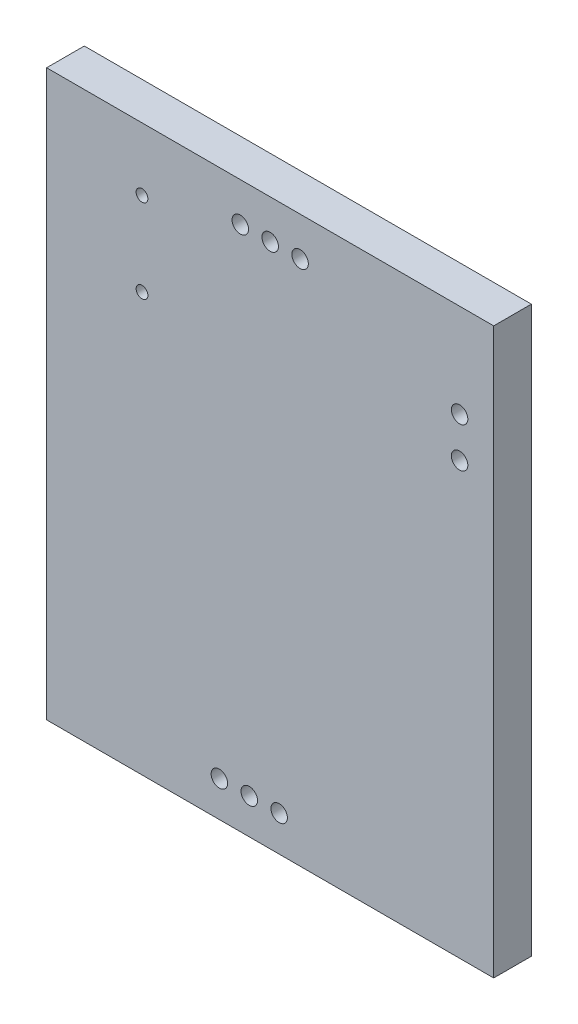
ISO-10303-21;
HEADER;
FILE_DESCRIPTION(('STEP AP214'),'2;1');
FILE_NAME('part.step','',(''),(''),'','','');
FILE_SCHEMA(('AUTOMOTIVE_DESIGN { 1 0 10303 214 1 1 1 1 }'));
ENDSEC;
DATA;
#1=APPLICATION_CONTEXT('core data for automotive mechanical design processes');
#2=APPLICATION_PROTOCOL_DEFINITION('international standard','automotive_design',2000,#1);
#3=PRODUCT_CONTEXT('',#1,'mechanical');
#4=PRODUCT('Part','Part','',(#3));
#5=PRODUCT_RELATED_PRODUCT_CATEGORY('part','',(#4));
#6=PRODUCT_DEFINITION_FORMATION('','',#4);
#7=PRODUCT_DEFINITION_CONTEXT('part definition',#1,'design');
#8=PRODUCT_DEFINITION('design','',#6,#7);
#9=PRODUCT_DEFINITION_SHAPE('','',#8);
#10=(LENGTH_UNIT() NAMED_UNIT(*) SI_UNIT(.MILLI.,.METRE.));
#11=(NAMED_UNIT(*) PLANE_ANGLE_UNIT() SI_UNIT($,.RADIAN.));
#12=(NAMED_UNIT(*) SI_UNIT($,.STERADIAN.) SOLID_ANGLE_UNIT());
#13=UNCERTAINTY_MEASURE_WITH_UNIT(LENGTH_MEASURE(1.E-05),#10,'distance_accuracy_value','');
#14=(GEOMETRIC_REPRESENTATION_CONTEXT(3) GLOBAL_UNCERTAINTY_ASSIGNED_CONTEXT((#13)) GLOBAL_UNIT_ASSIGNED_CONTEXT((#10,
#11,#12)) REPRESENTATION_CONTEXT('',''));
#15=CARTESIAN_POINT('',(0.,0.,0.));
#16=DIRECTION('',(0.,0.,1.));
#17=DIRECTION('',(1.,0.,0.));
#18=AXIS2_PLACEMENT_3D('',#15,#16,#17);
#19=CARTESIAN_POINT('',(19.668039116078,-21.26320315023,1.600028244856));
#20=DIRECTION('',(0.,0.,-1.));
#21=DIRECTION('',(-1.,0.,0.));
#22=AXIS2_PLACEMENT_3D('',#19,#20,#21);
#23=PLANE('',#22);
#24=CARTESIAN_POINT('',(27.714503429007,-14.94716789433,1.600028244856));
#25=DIRECTION('',(0.,0.,-1.));
#26=DIRECTION('',(-1.,0.,0.));
#27=AXIS2_PLACEMENT_3D('',#24,#25,#26);
#28=CIRCLE('',#27,0.350012700025);
#29=CARTESIAN_POINT('',(27.364490728982,-14.94716789433,1.600028244856));
#30=VERTEX_POINT('',#29);
#31=EDGE_CURVE('E108',#30,#30,#28,.T.);
#32=ORIENTED_EDGE('',*,*,#31,.T.);
#33=EDGE_LOOP('',(#32));
#34=FACE_BOUND('',#33,.T.);
#35=CARTESIAN_POINT('',(27.714503429007,-13.24714249428,1.600028244856));
#36=DIRECTION('',(0.,0.,-1.));
#37=DIRECTION('',(-1.,0.,0.));
#38=AXIS2_PLACEMENT_3D('',#35,#36,#37);
#39=CIRCLE('',#38,0.350012700025);
#40=CARTESIAN_POINT('',(27.364490728982,-13.24714249428,1.600028244856));
#41=VERTEX_POINT('',#40);
#42=EDGE_CURVE('E112',#41,#41,#39,.T.);
#43=ORIENTED_EDGE('',*,*,#42,.T.);
#44=EDGE_LOOP('',(#43));
#45=FACE_BOUND('',#44,.T.);
#46=CARTESIAN_POINT('',(20.939057658115,-10.92202184404,1.600028244856));
#47=DIRECTION('',(0.,0.,-1.));
#48=DIRECTION('',(-1.,0.,0.));
#49=AXIS2_PLACEMENT_3D('',#46,#47,#48);
#50=CIRCLE('',#49,0.350012700025);
#51=CARTESIAN_POINT('',(20.58904495809,-10.92202184404,1.600028244856));
#52=VERTEX_POINT('',#51);
#53=EDGE_CURVE('E115',#52,#52,#50,.T.);
#54=ORIENTED_EDGE('',*,*,#53,.T.);
#55=EDGE_LOOP('',(#54));
#56=FACE_BOUND('',#55,.T.);
#57=CARTESIAN_POINT('',(20.0508001016,-31.75006350012,1.600028244856));
#58=DIRECTION('',(0.,0.,-1.));
#59=DIRECTION('',(-1.,0.,0.));
#60=AXIS2_PLACEMENT_3D('',#57,#58,#59);
#61=CIRCLE('',#60,0.350012700025);
#62=CARTESIAN_POINT('',(19.700787401575,-31.75006350012,1.600028244856));
#63=VERTEX_POINT('',#62);
#64=EDGE_CURVE('E118',#63,#63,#61,.T.);
#65=ORIENTED_EDGE('',*,*,#64,.T.);
#66=EDGE_LOOP('',(#65));
#67=FACE_BOUND('',#66,.T.);
#68=CARTESIAN_POINT('',(19.66905511811,-10.92202184404,1.600028244856));
#69=DIRECTION('',(0.,0.,-1.));
#70=DIRECTION('',(-1.,0.,0.));
#71=AXIS2_PLACEMENT_3D('',#68,#69,#70);
#72=CIRCLE('',#71,0.350012700025);
#73=CARTESIAN_POINT('',(19.319042418085,-10.92202184404,1.600028244856));
#74=VERTEX_POINT('',#73);
#75=EDGE_CURVE('E121',#74,#74,#72,.T.);
#76=ORIENTED_EDGE('',*,*,#75,.T.);
#77=EDGE_LOOP('',(#76));
#78=FACE_BOUND('',#77,.T.);
#79=CARTESIAN_POINT('',(18.780797561595,-31.75006350012,1.600028244856));
#80=DIRECTION('',(0.,0.,-1.));
#81=DIRECTION('',(-1.,0.,0.));
#82=AXIS2_PLACEMENT_3D('',#79,#80,#81);
#83=CIRCLE('',#82,0.350012700025);
#84=CARTESIAN_POINT('',(18.43078486157,-31.75006350012,1.600028244856));
#85=VERTEX_POINT('',#84);
#86=EDGE_CURVE('E124',#85,#85,#83,.T.);
#87=ORIENTED_EDGE('',*,*,#86,.T.);
#88=EDGE_LOOP('',(#87));
#89=FACE_BOUND('',#88,.T.);
#90=CARTESIAN_POINT('',(18.399052578105,-10.92202184404,1.600028244856));
#91=DIRECTION('',(0.,0.,-1.));
#92=DIRECTION('',(-1.,0.,0.));
#93=AXIS2_PLACEMENT_3D('',#90,#91,#92);
#94=CIRCLE('',#93,0.350012700025);
#95=CARTESIAN_POINT('',(18.04903987808,-10.92202184404,1.600028244856));
#96=VERTEX_POINT('',#95);
#97=EDGE_CURVE('E127',#96,#96,#94,.T.);
#98=ORIENTED_EDGE('',*,*,#97,.T.);
#99=EDGE_LOOP('',(#98));
#100=FACE_BOUND('',#99,.T.);
#101=CARTESIAN_POINT('',(17.51079502159,-31.75006350012,1.600028244856));
#102=DIRECTION('',(0.,0.,-1.));
#103=DIRECTION('',(-1.,0.,0.));
#104=AXIS2_PLACEMENT_3D('',#101,#102,#103);
#105=CIRCLE('',#104,0.350012700025);
#106=CARTESIAN_POINT('',(17.160782321565,-31.75006350012,1.600028244856));
#107=VERTEX_POINT('',#106);
#108=EDGE_CURVE('E130',#107,#107,#105,.T.);
#109=ORIENTED_EDGE('',*,*,#108,.T.);
#110=EDGE_LOOP('',(#109));
#111=FACE_BOUND('',#110,.T.);
#112=CARTESIAN_POINT('',(14.224028448057,-15.49403098806,1.600028244856));
#113=DIRECTION('',(0.,0.,-1.));
#114=DIRECTION('',(-1.,0.,0.));
#115=AXIS2_PLACEMENT_3D('',#112,#113,#114);
#116=CIRCLE('',#115,0.25);
#117=CARTESIAN_POINT('',(13.974028448057,-15.49403098806,1.600028244856));
#118=VERTEX_POINT('',#117);
#119=EDGE_CURVE('E132',#118,#118,#116,.T.);
#120=ORIENTED_EDGE('',*,*,#119,.T.);
#121=EDGE_LOOP('',(#120));
#122=FACE_BOUND('',#121,.T.);
#123=CARTESIAN_POINT('',(14.224028448057,-11.93802387604,1.600028244856));
#124=DIRECTION('',(0.,0.,-1.));
#125=DIRECTION('',(-1.,0.,0.));
#126=AXIS2_PLACEMENT_3D('',#123,#124,#125);
#127=CIRCLE('',#126,0.25);
#128=CARTESIAN_POINT('',(13.974028448057,-11.93802387604,1.600028244856));
#129=VERTEX_POINT('',#128);
#130=EDGE_CURVE('E20',#129,#129,#127,.T.);
#131=ORIENTED_EDGE('',*,*,#130,.T.);
#132=EDGE_LOOP('',(#131));
#133=FACE_BOUND('',#132,.T.);
#134=DIRECTION('',(0.,-1.,0.));
#135=VECTOR('',#134,1.);
#136=CARTESIAN_POINT('',(10.172720345441,-33.25836677673,1.600028244856));
#137=LINE('',#136,#135);
#138=CARTESIAN_POINT('',(10.172720345441,-33.25836677673,1.600028244856));
#139=VERTEX_POINT('',#138);
#140=CARTESIAN_POINT('',(10.172720345441,-9.268039523733,1.600028244856));
#141=VERTEX_POINT('',#140);
#142=EDGE_CURVE('E70',#139,#141,#137,.F.);
#143=ORIENTED_EDGE('',*,*,#142,.F.);
#144=DIRECTION('',(1.,0.,0.));
#145=VECTOR('',#144,1.);
#146=CARTESIAN_POINT('',(29.163357886716,-33.25836677673,1.600028244856));
#147=LINE('',#146,#145);
#148=CARTESIAN_POINT('',(29.163357886716,-33.25836677673,1.600028244856));
#149=VERTEX_POINT('',#148);
#150=EDGE_CURVE('E55',#149,#139,#147,.F.);
#151=ORIENTED_EDGE('',*,*,#150,.F.);
#152=DIRECTION('',(0.,1.,0.));
#153=VECTOR('',#152,1.);
#154=CARTESIAN_POINT('',(29.163357886716,-9.268039523733,1.600028244856));
#155=LINE('',#154,#153);
#156=CARTESIAN_POINT('',(29.163357886716,-9.268039523733,1.600028244856));
#157=VERTEX_POINT('',#156);
#158=EDGE_CURVE('E60',#157,#149,#155,.F.);
#159=ORIENTED_EDGE('',*,*,#158,.F.);
#160=DIRECTION('',(1.,0.,0.));
#161=VECTOR('',#160,1.);
#162=CARTESIAN_POINT('',(10.172720345441,-9.268039523733,1.600028244856));
#163=LINE('',#162,#161);
#164=EDGE_CURVE('E139',#141,#157,#163,.T.);
#165=ORIENTED_EDGE('',*,*,#164,.F.);
#166=EDGE_LOOP('',(#143,#151,#159,#165));
#167=FACE_BOUND('',#166,.T.);
#168=ADVANCED_FACE('F17',(#34,#45,#56,#67,#78,#89,#100,#111,#122,#133,#167),#23,.F.);
#169=CARTESIAN_POINT('',(29.163357886716,-9.268039523733,0.));
#170=DIRECTION('',(1.,0.,0.));
#171=DIRECTION('',(0.,0.,-1.));
#172=AXIS2_PLACEMENT_3D('',#169,#170,#171);
#173=PLANE('',#172);
#174=DIRECTION('',(0.,0.,-1.));
#175=VECTOR('',#174,1.);
#176=CARTESIAN_POINT('',(29.163357886716,-33.25836677673,0.));
#177=LINE('',#176,#175);
#178=CARTESIAN_POINT('',(29.163357886716,-33.25836677673,0.));
#179=VERTEX_POINT('',#178);
#180=EDGE_CURVE('E62',#179,#149,#177,.F.);
#181=ORIENTED_EDGE('',*,*,#180,.F.);
#182=DIRECTION('',(0.,1.,0.));
#183=VECTOR('',#182,1.);
#184=CARTESIAN_POINT('',(29.163357886716,-21.26320315023,0.));
#185=LINE('',#184,#183);
#186=CARTESIAN_POINT('',(29.163357886716,-9.268039523733,0.));
#187=VERTEX_POINT('',#186);
#188=EDGE_CURVE('E111',#187,#179,#185,.F.);
#189=ORIENTED_EDGE('',*,*,#188,.F.);
#190=DIRECTION('',(0.,0.,1.));
#191=VECTOR('',#190,1.);
#192=CARTESIAN_POINT('',(29.163357886716,-9.268039523733,0.));
#193=LINE('',#192,#191);
#194=EDGE_CURVE('E65',#157,#187,#193,.F.);
#195=ORIENTED_EDGE('',*,*,#194,.F.);
#196=ORIENTED_EDGE('',*,*,#158,.T.);
#197=EDGE_LOOP('',(#181,#189,#195,#196));
#198=FACE_BOUND('',#197,.T.);
#199=ADVANCED_FACE('F61',(#198),#173,.T.);
#200=CARTESIAN_POINT('',(29.163357886716,-33.25836677673,0.));
#201=DIRECTION('',(0.,-1.,0.));
#202=DIRECTION('',(0.,0.,-1.));
#203=AXIS2_PLACEMENT_3D('',#200,#201,#202);
#204=PLANE('',#203);
#205=DIRECTION('',(0.,0.,1.));
#206=VECTOR('',#205,1.);
#207=CARTESIAN_POINT('',(10.172720345441,-33.25836677673,0.));
#208=LINE('',#207,#206);
#209=CARTESIAN_POINT('',(10.172720345441,-33.25836677673,0.));
#210=VERTEX_POINT('',#209);
#211=EDGE_CURVE('E72',#210,#139,#208,.T.);
#212=ORIENTED_EDGE('',*,*,#211,.F.);
#213=DIRECTION('',(-1.,0.,0.));
#214=VECTOR('',#213,1.);
#215=CARTESIAN_POINT('',(19.668039116078,-33.25836677673,0.));
#216=LINE('',#215,#214);
#217=EDGE_CURVE('E76',#179,#210,#216,.T.);
#218=ORIENTED_EDGE('',*,*,#217,.F.);
#219=ORIENTED_EDGE('',*,*,#180,.T.);
#220=ORIENTED_EDGE('',*,*,#150,.T.);
#221=EDGE_LOOP('',(#212,#218,#219,#220));
#222=FACE_BOUND('',#221,.T.);
#223=ADVANCED_FACE('F74',(#222),#204,.T.);
#224=CARTESIAN_POINT('',(10.172720345441,-33.25836677673,0.));
#225=DIRECTION('',(-1.,0.,0.));
#226=DIRECTION('',(0.,-1.,0.));
#227=AXIS2_PLACEMENT_3D('',#224,#225,#226);
#228=PLANE('',#227);
#229=DIRECTION('',(0.,0.,1.));
#230=VECTOR('',#229,1.);
#231=CARTESIAN_POINT('',(10.172720345441,-9.268039523733,0.));
#232=LINE('',#231,#230);
#233=CARTESIAN_POINT('',(10.172720345441,-9.268039523733,0.));
#234=VERTEX_POINT('',#233);
#235=EDGE_CURVE('E35',#234,#141,#232,.T.);
#236=ORIENTED_EDGE('',*,*,#235,.F.);
#237=DIRECTION('',(0.,1.,0.));
#238=VECTOR('',#237,1.);
#239=CARTESIAN_POINT('',(10.172720345441,-21.26320315023,0.));
#240=LINE('',#239,#238);
#241=EDGE_CURVE('E150',#210,#234,#240,.T.);
#242=ORIENTED_EDGE('',*,*,#241,.F.);
#243=ORIENTED_EDGE('',*,*,#211,.T.);
#244=ORIENTED_EDGE('',*,*,#142,.T.);
#245=EDGE_LOOP('',(#236,#242,#243,#244));
#246=FACE_BOUND('',#245,.T.);
#247=ADVANCED_FACE('F148',(#246),#228,.T.);
#248=CARTESIAN_POINT('',(10.172720345441,-9.268039523733,0.));
#249=DIRECTION('',(0.,1.,0.));
#250=DIRECTION('',(0.,0.,1.));
#251=AXIS2_PLACEMENT_3D('',#248,#249,#250);
#252=PLANE('',#251);
#253=ORIENTED_EDGE('',*,*,#194,.T.);
#254=DIRECTION('',(-1.,0.,0.));
#255=VECTOR('',#254,1.);
#256=CARTESIAN_POINT('',(19.668039116078,-9.268039523733,0.));
#257=LINE('',#256,#255);
#258=EDGE_CURVE('E107',#234,#187,#257,.F.);
#259=ORIENTED_EDGE('',*,*,#258,.F.);
#260=ORIENTED_EDGE('',*,*,#235,.T.);
#261=ORIENTED_EDGE('',*,*,#164,.T.);
#262=EDGE_LOOP('',(#253,#259,#260,#261));
#263=FACE_BOUND('',#262,.T.);
#264=ADVANCED_FACE('F155',(#263),#252,.T.);
#265=CARTESIAN_POINT('',(14.224028448057,-11.93802387604,0.));
#266=DIRECTION('',(0.,0.,-1.));
#267=DIRECTION('',(-1.,0.,0.));
#268=AXIS2_PLACEMENT_3D('',#265,#266,#267);
#269=CYLINDRICAL_SURFACE('',#268,0.25);
#270=ORIENTED_EDGE('',*,*,#130,.F.);
#271=EDGE_LOOP('',(#270));
#272=FACE_BOUND('',#271,.T.);
#273=CARTESIAN_POINT('',(14.224028448057,-11.93802387604,0.));
#274=DIRECTION('',(0.,0.,-1.));
#275=DIRECTION('',(-1.,0.,0.));
#276=AXIS2_PLACEMENT_3D('',#273,#274,#275);
#277=CIRCLE('',#276,0.25);
#278=CARTESIAN_POINT('',(13.974028448057,-11.93802387604,0.));
#279=VERTEX_POINT('',#278);
#280=EDGE_CURVE('E104',#279,#279,#277,.F.);
#281=ORIENTED_EDGE('',*,*,#280,.F.);
#282=EDGE_LOOP('',(#281));
#283=FACE_BOUND('',#282,.T.);
#284=ADVANCED_FACE('F157',(#272,#283),#269,.F.);
#285=CARTESIAN_POINT('',(14.224028448057,-15.49403098806,0.));
#286=DIRECTION('',(0.,0.,-1.));
#287=DIRECTION('',(-1.,0.,0.));
#288=AXIS2_PLACEMENT_3D('',#285,#286,#287);
#289=CYLINDRICAL_SURFACE('',#288,0.25);
#290=ORIENTED_EDGE('',*,*,#119,.F.);
#291=EDGE_LOOP('',(#290));
#292=FACE_BOUND('',#291,.T.);
#293=CARTESIAN_POINT('',(14.224028448057,-15.49403098806,0.));
#294=DIRECTION('',(0.,0.,-1.));
#295=DIRECTION('',(-1.,0.,0.));
#296=AXIS2_PLACEMENT_3D('',#293,#294,#295);
#297=CIRCLE('',#296,0.25);
#298=CARTESIAN_POINT('',(13.974028448057,-15.49403098806,0.));
#299=VERTEX_POINT('',#298);
#300=EDGE_CURVE('E101',#299,#299,#297,.F.);
#301=ORIENTED_EDGE('',*,*,#300,.F.);
#302=EDGE_LOOP('',(#301));
#303=FACE_BOUND('',#302,.T.);
#304=ADVANCED_FACE('F164',(#292,#303),#289,.F.);
#305=CARTESIAN_POINT('',(17.51079502159,-31.75006350012,0.));
#306=DIRECTION('',(0.,0.,-1.));
#307=DIRECTION('',(-1.,0.,0.));
#308=AXIS2_PLACEMENT_3D('',#305,#306,#307);
#309=CYLINDRICAL_SURFACE('',#308,0.350012700025);
#310=ORIENTED_EDGE('',*,*,#108,.F.);
#311=EDGE_LOOP('',(#310));
#312=FACE_BOUND('',#311,.T.);
#313=CARTESIAN_POINT('',(17.51079502159,-31.75006350012,0.));
#314=DIRECTION('',(0.,0.,-1.));
#315=DIRECTION('',(-1.,0.,0.));
#316=AXIS2_PLACEMENT_3D('',#313,#314,#315);
#317=CIRCLE('',#316,0.350012700025);
#318=CARTESIAN_POINT('',(17.160782321565,-31.75006350012,0.));
#319=VERTEX_POINT('',#318);
#320=EDGE_CURVE('E98',#319,#319,#317,.F.);
#321=ORIENTED_EDGE('',*,*,#320,.F.);
#322=EDGE_LOOP('',(#321));
#323=FACE_BOUND('',#322,.T.);
#324=ADVANCED_FACE('F202',(#312,#323),#309,.F.);
#325=CARTESIAN_POINT('',(18.399052578105,-10.92202184404,0.));
#326=DIRECTION('',(0.,0.,-1.));
#327=DIRECTION('',(-1.,0.,0.));
#328=AXIS2_PLACEMENT_3D('',#325,#326,#327);
#329=CYLINDRICAL_SURFACE('',#328,0.350012700025);
#330=ORIENTED_EDGE('',*,*,#97,.F.);
#331=EDGE_LOOP('',(#330));
#332=FACE_BOUND('',#331,.T.);
#333=CARTESIAN_POINT('',(18.399052578105,-10.92202184404,0.));
#334=DIRECTION('',(0.,0.,-1.));
#335=DIRECTION('',(-1.,0.,0.));
#336=AXIS2_PLACEMENT_3D('',#333,#334,#335);
#337=CIRCLE('',#336,0.350012700025);
#338=CARTESIAN_POINT('',(18.04903987808,-10.92202184404,0.));
#339=VERTEX_POINT('',#338);
#340=EDGE_CURVE('E95',#339,#339,#337,.F.);
#341=ORIENTED_EDGE('',*,*,#340,.F.);
#342=EDGE_LOOP('',(#341));
#343=FACE_BOUND('',#342,.T.);
#344=ADVANCED_FACE('F198',(#332,#343),#329,.F.);
#345=CARTESIAN_POINT('',(18.780797561595,-31.75006350012,0.));
#346=DIRECTION('',(0.,0.,-1.));
#347=DIRECTION('',(-1.,0.,0.));
#348=AXIS2_PLACEMENT_3D('',#345,#346,#347);
#349=CYLINDRICAL_SURFACE('',#348,0.350012700025);
#350=ORIENTED_EDGE('',*,*,#86,.F.);
#351=EDGE_LOOP('',(#350));
#352=FACE_BOUND('',#351,.T.);
#353=CARTESIAN_POINT('',(18.780797561595,-31.75006350012,0.));
#354=DIRECTION('',(0.,0.,-1.));
#355=DIRECTION('',(-1.,0.,0.));
#356=AXIS2_PLACEMENT_3D('',#353,#354,#355);
#357=CIRCLE('',#356,0.350012700025);
#358=CARTESIAN_POINT('',(18.43078486157,-31.75006350012,0.));
#359=VERTEX_POINT('',#358);
#360=EDGE_CURVE('E92',#359,#359,#357,.F.);
#361=ORIENTED_EDGE('',*,*,#360,.F.);
#362=EDGE_LOOP('',(#361));
#363=FACE_BOUND('',#362,.T.);
#364=ADVANCED_FACE('F194',(#352,#363),#349,.F.);
#365=CARTESIAN_POINT('',(19.66905511811,-10.92202184404,0.));
#366=DIRECTION('',(0.,0.,-1.));
#367=DIRECTION('',(-1.,0.,0.));
#368=AXIS2_PLACEMENT_3D('',#365,#366,#367);
#369=CYLINDRICAL_SURFACE('',#368,0.350012700025);
#370=ORIENTED_EDGE('',*,*,#75,.F.);
#371=EDGE_LOOP('',(#370));
#372=FACE_BOUND('',#371,.T.);
#373=CARTESIAN_POINT('',(19.66905511811,-10.92202184404,0.));
#374=DIRECTION('',(0.,0.,-1.));
#375=DIRECTION('',(-1.,0.,0.));
#376=AXIS2_PLACEMENT_3D('',#373,#374,#375);
#377=CIRCLE('',#376,0.350012700025);
#378=CARTESIAN_POINT('',(19.319042418085,-10.92202184404,0.));
#379=VERTEX_POINT('',#378);
#380=EDGE_CURVE('E89',#379,#379,#377,.F.);
#381=ORIENTED_EDGE('',*,*,#380,.F.);
#382=EDGE_LOOP('',(#381));
#383=FACE_BOUND('',#382,.T.);
#384=ADVANCED_FACE('F190',(#372,#383),#369,.F.);
#385=CARTESIAN_POINT('',(20.0508001016,-31.75006350012,0.));
#386=DIRECTION('',(0.,0.,-1.));
#387=DIRECTION('',(-1.,0.,0.));
#388=AXIS2_PLACEMENT_3D('',#385,#386,#387);
#389=CYLINDRICAL_SURFACE('',#388,0.350012700025);
#390=ORIENTED_EDGE('',*,*,#64,.F.);
#391=EDGE_LOOP('',(#390));
#392=FACE_BOUND('',#391,.T.);
#393=CARTESIAN_POINT('',(20.0508001016,-31.75006350012,0.));
#394=DIRECTION('',(0.,0.,-1.));
#395=DIRECTION('',(-1.,0.,0.));
#396=AXIS2_PLACEMENT_3D('',#393,#394,#395);
#397=CIRCLE('',#396,0.350012700025);
#398=CARTESIAN_POINT('',(19.700787401575,-31.75006350012,0.));
#399=VERTEX_POINT('',#398);
#400=EDGE_CURVE('E86',#399,#399,#397,.F.);
#401=ORIENTED_EDGE('',*,*,#400,.F.);
#402=EDGE_LOOP('',(#401));
#403=FACE_BOUND('',#402,.T.);
#404=ADVANCED_FACE('F186',(#392,#403),#389,.F.);
#405=CARTESIAN_POINT('',(20.939057658115,-10.92202184404,0.));
#406=DIRECTION('',(0.,0.,-1.));
#407=DIRECTION('',(-1.,0.,0.));
#408=AXIS2_PLACEMENT_3D('',#405,#406,#407);
#409=CYLINDRICAL_SURFACE('',#408,0.350012700025);
#410=ORIENTED_EDGE('',*,*,#53,.F.);
#411=EDGE_LOOP('',(#410));
#412=FACE_BOUND('',#411,.T.);
#413=CARTESIAN_POINT('',(20.939057658115,-10.92202184404,0.));
#414=DIRECTION('',(0.,0.,-1.));
#415=DIRECTION('',(-1.,0.,0.));
#416=AXIS2_PLACEMENT_3D('',#413,#414,#415);
#417=CIRCLE('',#416,0.350012700025);
#418=CARTESIAN_POINT('',(20.58904495809,-10.92202184404,0.));
#419=VERTEX_POINT('',#418);
#420=EDGE_CURVE('E83',#419,#419,#417,.F.);
#421=ORIENTED_EDGE('',*,*,#420,.F.);
#422=EDGE_LOOP('',(#421));
#423=FACE_BOUND('',#422,.T.);
#424=ADVANCED_FACE('F182',(#412,#423),#409,.F.);
#425=CARTESIAN_POINT('',(27.714503429007,-13.24714249428,0.));
#426=DIRECTION('',(0.,0.,-1.));
#427=DIRECTION('',(-1.,0.,0.));
#428=AXIS2_PLACEMENT_3D('',#425,#426,#427);
#429=CYLINDRICAL_SURFACE('',#428,0.350012700025);
#430=ORIENTED_EDGE('',*,*,#42,.F.);
#431=EDGE_LOOP('',(#430));
#432=FACE_BOUND('',#431,.T.);
#433=CARTESIAN_POINT('',(27.714503429007,-13.24714249428,0.));
#434=DIRECTION('',(0.,0.,-1.));
#435=DIRECTION('',(-1.,0.,0.));
#436=AXIS2_PLACEMENT_3D('',#433,#434,#435);
#437=CIRCLE('',#436,0.350012700025);
#438=CARTESIAN_POINT('',(27.364490728982,-13.24714249428,0.));
#439=VERTEX_POINT('',#438);
#440=EDGE_CURVE('E26',#439,#439,#437,.F.);
#441=ORIENTED_EDGE('',*,*,#440,.F.);
#442=EDGE_LOOP('',(#441));
#443=FACE_BOUND('',#442,.T.);
#444=ADVANCED_FACE('F175',(#432,#443),#429,.F.);
#445=CARTESIAN_POINT('',(27.714503429007,-14.94716789433,0.));
#446=DIRECTION('',(0.,0.,-1.));
#447=DIRECTION('',(-1.,0.,0.));
#448=AXIS2_PLACEMENT_3D('',#445,#446,#447);
#449=CYLINDRICAL_SURFACE('',#448,0.350012700025);
#450=ORIENTED_EDGE('',*,*,#31,.F.);
#451=EDGE_LOOP('',(#450));
#452=FACE_BOUND('',#451,.T.);
#453=CARTESIAN_POINT('',(27.714503429007,-14.94716789433,0.));
#454=DIRECTION('',(0.,0.,-1.));
#455=DIRECTION('',(-1.,0.,0.));
#456=AXIS2_PLACEMENT_3D('',#453,#454,#455);
#457=CIRCLE('',#456,0.350012700025);
#458=CARTESIAN_POINT('',(27.364490728982,-14.94716789433,0.));
#459=VERTEX_POINT('',#458);
#460=EDGE_CURVE('E11',#459,#459,#457,.F.);
#461=ORIENTED_EDGE('',*,*,#460,.F.);
#462=EDGE_LOOP('',(#461));
#463=FACE_BOUND('',#462,.T.);
#464=ADVANCED_FACE('F169',(#452,#463),#449,.F.);
#465=CARTESIAN_POINT('',(19.668039116078,-21.26320315023,0.));
#466=DIRECTION('',(0.,0.,-1.));
#467=DIRECTION('',(-1.,0.,0.));
#468=AXIS2_PLACEMENT_3D('',#465,#466,#467);
#469=PLANE('',#468);
#470=ORIENTED_EDGE('',*,*,#460,.T.);
#471=EDGE_LOOP('',(#470));
#472=FACE_BOUND('',#471,.T.);
#473=ORIENTED_EDGE('',*,*,#440,.T.);
#474=EDGE_LOOP('',(#473));
#475=FACE_BOUND('',#474,.T.);
#476=ORIENTED_EDGE('',*,*,#420,.T.);
#477=EDGE_LOOP('',(#476));
#478=FACE_BOUND('',#477,.T.);
#479=ORIENTED_EDGE('',*,*,#400,.T.);
#480=EDGE_LOOP('',(#479));
#481=FACE_BOUND('',#480,.T.);
#482=ORIENTED_EDGE('',*,*,#380,.T.);
#483=EDGE_LOOP('',(#482));
#484=FACE_BOUND('',#483,.T.);
#485=ORIENTED_EDGE('',*,*,#360,.T.);
#486=EDGE_LOOP('',(#485));
#487=FACE_BOUND('',#486,.T.);
#488=ORIENTED_EDGE('',*,*,#340,.T.);
#489=EDGE_LOOP('',(#488));
#490=FACE_BOUND('',#489,.T.);
#491=ORIENTED_EDGE('',*,*,#320,.T.);
#492=EDGE_LOOP('',(#491));
#493=FACE_BOUND('',#492,.T.);
#494=ORIENTED_EDGE('',*,*,#300,.T.);
#495=EDGE_LOOP('',(#494));
#496=FACE_BOUND('',#495,.T.);
#497=ORIENTED_EDGE('',*,*,#280,.T.);
#498=EDGE_LOOP('',(#497));
#499=FACE_BOUND('',#498,.T.);
#500=ORIENTED_EDGE('',*,*,#241,.T.);
#501=ORIENTED_EDGE('',*,*,#258,.T.);
#502=ORIENTED_EDGE('',*,*,#188,.T.);
#503=ORIENTED_EDGE('',*,*,#217,.T.);
#504=EDGE_LOOP('',(#500,#501,#502,#503));
#505=FACE_BOUND('',#504,.T.);
#506=ADVANCED_FACE('F153',(#472,#475,#478,#481,#484,#487,#490,#493,#496,#499,#505),#469,.T.);
#507=CLOSED_SHELL('',(#168,#199,#223,#247,#264,#284,#304,#324,#344,#364,#384,#404,#424,#444,
#464,#506));
#508=MANIFOLD_SOLID_BREP('B1',#507);
#509=ADVANCED_BREP_SHAPE_REPRESENTATION('',(#18,#508),#14);
#510=SHAPE_DEFINITION_REPRESENTATION(#9,#509);
ENDSEC;
END-ISO-10303-21;
